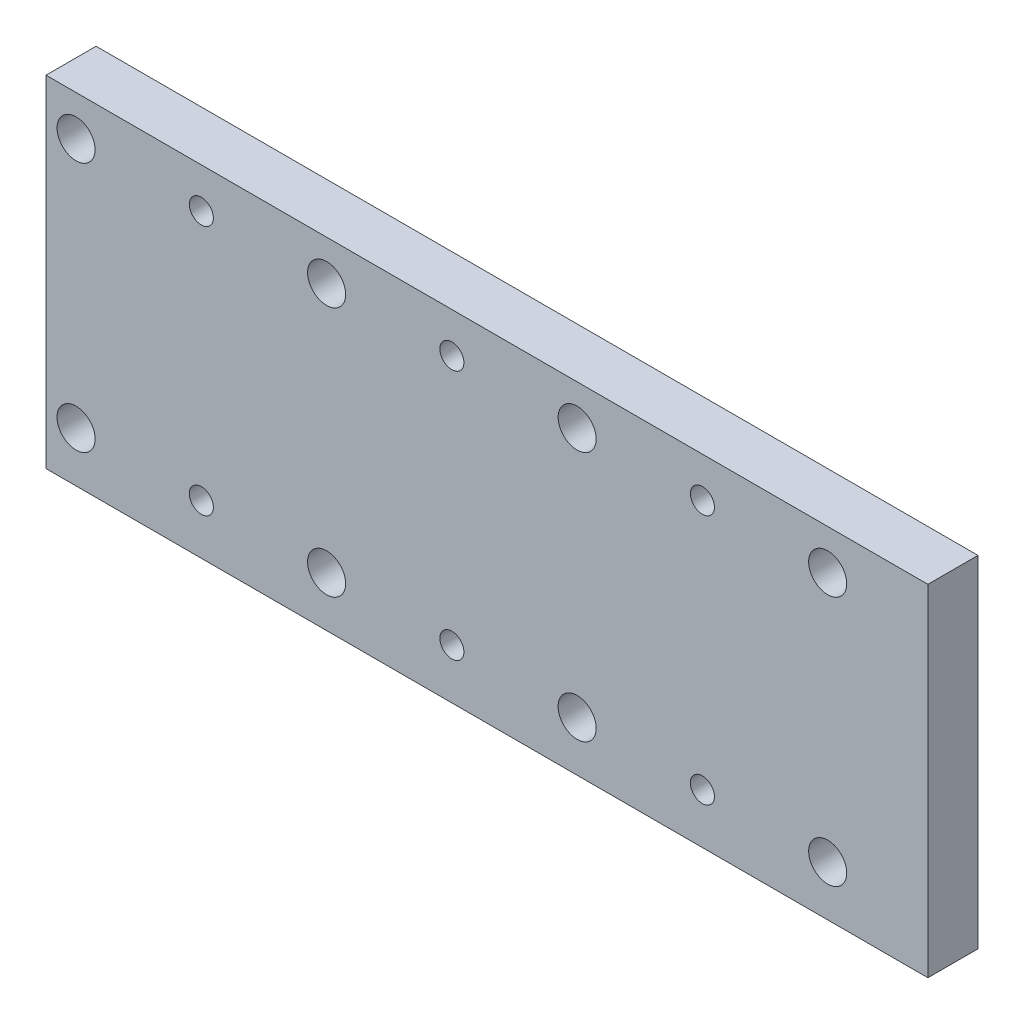
ISO-10303-21;
HEADER;
FILE_DESCRIPTION(('STEP AP214'),'2;1');
FILE_NAME('part.step','',(''),(''),'','','');
FILE_SCHEMA(('AUTOMOTIVE_DESIGN { 1 0 10303 214 1 1 1 1 }'));
ENDSEC;
DATA;
#1=APPLICATION_CONTEXT('core data for automotive mechanical design processes');
#2=APPLICATION_PROTOCOL_DEFINITION('international standard','automotive_design',2000,#1);
#3=PRODUCT_CONTEXT('',#1,'mechanical');
#4=PRODUCT('Part','Part','',(#3));
#5=PRODUCT_RELATED_PRODUCT_CATEGORY('part','',(#4));
#6=PRODUCT_DEFINITION_FORMATION('','',#4);
#7=PRODUCT_DEFINITION_CONTEXT('part definition',#1,'design');
#8=PRODUCT_DEFINITION('design','',#6,#7);
#9=PRODUCT_DEFINITION_SHAPE('','',#8);
#10=(LENGTH_UNIT() NAMED_UNIT(*) SI_UNIT(.MILLI.,.METRE.));
#11=(NAMED_UNIT(*) PLANE_ANGLE_UNIT() SI_UNIT($,.RADIAN.));
#12=(NAMED_UNIT(*) SI_UNIT($,.STERADIAN.) SOLID_ANGLE_UNIT());
#13=UNCERTAINTY_MEASURE_WITH_UNIT(LENGTH_MEASURE(1.E-05),#10,'distance_accuracy_value','');
#14=(GEOMETRIC_REPRESENTATION_CONTEXT(3) GLOBAL_UNCERTAINTY_ASSIGNED_CONTEXT((#13)) GLOBAL_UNIT_ASSIGNED_CONTEXT((#10,
#11,#12)) REPRESENTATION_CONTEXT('',''));
#15=CARTESIAN_POINT('',(0.,0.,0.));
#16=DIRECTION('',(0.,0.,1.));
#17=DIRECTION('',(1.,0.,0.));
#18=AXIS2_PLACEMENT_3D('',#15,#16,#17);
#19=CARTESIAN_POINT('',(220.,85.,25.));
#20=DIRECTION('',(-1.,0.,0.));
#21=DIRECTION('',(0.,0.,1.));
#22=AXIS2_PLACEMENT_3D('',#19,#20,#21);
#23=PLANE('',#22);
#24=DIRECTION('',(0.,1.,0.));
#25=VECTOR('',#24,1.);
#26=CARTESIAN_POINT('',(220.,85.,0.));
#27=LINE('',#26,#25);
#28=CARTESIAN_POINT('',(220.,-85.,0.));
#29=VERTEX_POINT('',#28);
#30=CARTESIAN_POINT('',(220.,85.,0.));
#31=VERTEX_POINT('',#30);
#32=EDGE_CURVE('E107',#29,#31,#27,.T.);
#33=ORIENTED_EDGE('',*,*,#32,.T.);
#34=DIRECTION('',(0.,0.,-1.));
#35=VECTOR('',#34,1.);
#36=CARTESIAN_POINT('',(220.,85.,25.));
#37=LINE('',#36,#35);
#38=CARTESIAN_POINT('',(220.,85.,25.));
#39=VERTEX_POINT('',#38);
#40=EDGE_CURVE('E12',#39,#31,#37,.T.);
#41=ORIENTED_EDGE('',*,*,#40,.F.);
#42=DIRECTION('',(0.,1.,0.));
#43=VECTOR('',#42,1.);
#44=CARTESIAN_POINT('',(220.,85.,25.));
#45=LINE('',#44,#43);
#46=CARTESIAN_POINT('',(220.,-85.,25.));
#47=VERTEX_POINT('',#46);
#48=EDGE_CURVE('E95',#47,#39,#45,.T.);
#49=ORIENTED_EDGE('',*,*,#48,.F.);
#50=DIRECTION('',(0.,0.,-1.));
#51=VECTOR('',#50,1.);
#52=CARTESIAN_POINT('',(220.,-85.,25.));
#53=LINE('',#52,#51);
#54=EDGE_CURVE('E103',#47,#29,#53,.T.);
#55=ORIENTED_EDGE('',*,*,#54,.T.);
#56=EDGE_LOOP('',(#33,#41,#49,#55));
#57=FACE_BOUND('',#56,.T.);
#58=ADVANCED_FACE('F44',(#57),#23,.F.);
#59=CARTESIAN_POINT('',(-220.,85.,25.));
#60=DIRECTION('',(0.,-1.,0.));
#61=DIRECTION('',(0.,0.,-1.));
#62=AXIS2_PLACEMENT_3D('',#59,#60,#61);
#63=PLANE('',#62);
#64=DIRECTION('',(-1.,0.,0.));
#65=VECTOR('',#64,1.);
#66=CARTESIAN_POINT('',(-220.,85.,0.));
#67=LINE('',#66,#65);
#68=CARTESIAN_POINT('',(-220.,85.,0.));
#69=VERTEX_POINT('',#68);
#70=EDGE_CURVE('E99',#31,#69,#67,.T.);
#71=ORIENTED_EDGE('',*,*,#70,.T.);
#72=DIRECTION('',(0.,0.,-1.));
#73=VECTOR('',#72,1.);
#74=CARTESIAN_POINT('',(-220.,85.,25.));
#75=LINE('',#74,#73);
#76=CARTESIAN_POINT('',(-220.,85.,25.));
#77=VERTEX_POINT('',#76);
#78=EDGE_CURVE('E52',#77,#69,#75,.T.);
#79=ORIENTED_EDGE('',*,*,#78,.F.);
#80=DIRECTION('',(-1.,0.,0.));
#81=VECTOR('',#80,1.);
#82=CARTESIAN_POINT('',(-220.,85.,25.));
#83=LINE('',#82,#81);
#84=EDGE_CURVE('E90',#39,#77,#83,.T.);
#85=ORIENTED_EDGE('',*,*,#84,.F.);
#86=ORIENTED_EDGE('',*,*,#40,.T.);
#87=EDGE_LOOP('',(#71,#79,#85,#86));
#88=FACE_BOUND('',#87,.T.);
#89=ADVANCED_FACE('F98',(#88),#63,.F.);
#90=CARTESIAN_POINT('',(-220.,85.,25.));
#91=DIRECTION('',(1.,0.,0.));
#92=DIRECTION('',(0.,0.,-1.));
#93=AXIS2_PLACEMENT_3D('',#90,#91,#92);
#94=PLANE('',#93);
#95=DIRECTION('',(0.,-1.,0.));
#96=VECTOR('',#95,1.);
#97=CARTESIAN_POINT('',(-220.,85.,0.));
#98=LINE('',#97,#96);
#99=CARTESIAN_POINT('',(-220.,-85.,0.));
#100=VERTEX_POINT('',#99);
#101=EDGE_CURVE('E77',#69,#100,#98,.T.);
#102=ORIENTED_EDGE('',*,*,#101,.T.);
#103=DIRECTION('',(0.,0.,-1.));
#104=VECTOR('',#103,1.);
#105=CARTESIAN_POINT('',(-220.,-85.,25.));
#106=LINE('',#105,#104);
#107=CARTESIAN_POINT('',(-220.,-85.,25.));
#108=VERTEX_POINT('',#107);
#109=EDGE_CURVE('E100',#108,#100,#106,.T.);
#110=ORIENTED_EDGE('',*,*,#109,.F.);
#111=DIRECTION('',(0.,-1.,0.));
#112=VECTOR('',#111,1.);
#113=CARTESIAN_POINT('',(-220.,85.,25.));
#114=LINE('',#113,#112);
#115=EDGE_CURVE('E93',#77,#108,#114,.T.);
#116=ORIENTED_EDGE('',*,*,#115,.F.);
#117=ORIENTED_EDGE('',*,*,#78,.T.);
#118=EDGE_LOOP('',(#102,#110,#116,#117));
#119=FACE_BOUND('',#118,.T.);
#120=ADVANCED_FACE('F101',(#119),#94,.F.);
#121=CARTESIAN_POINT('',(-220.,-85.,25.));
#122=DIRECTION('',(0.,1.,0.));
#123=DIRECTION('',(0.,0.,1.));
#124=AXIS2_PLACEMENT_3D('',#121,#122,#123);
#125=PLANE('',#124);
#126=DIRECTION('',(1.,0.,0.));
#127=VECTOR('',#126,1.);
#128=CARTESIAN_POINT('',(-220.,-85.,0.));
#129=LINE('',#128,#127);
#130=EDGE_CURVE('E83',#100,#29,#129,.T.);
#131=ORIENTED_EDGE('',*,*,#130,.T.);
#132=ORIENTED_EDGE('',*,*,#54,.F.);
#133=DIRECTION('',(1.,0.,0.));
#134=VECTOR('',#133,1.);
#135=CARTESIAN_POINT('',(-220.,-85.,25.));
#136=LINE('',#135,#134);
#137=EDGE_CURVE('E60',#108,#47,#136,.T.);
#138=ORIENTED_EDGE('',*,*,#137,.F.);
#139=ORIENTED_EDGE('',*,*,#109,.T.);
#140=EDGE_LOOP('',(#131,#132,#138,#139));
#141=FACE_BOUND('',#140,.T.);
#142=ADVANCED_FACE('F118',(#141),#125,.F.);
#143=CARTESIAN_POINT('',(0.,0.,25.));
#144=DIRECTION('',(0.,0.,1.));
#145=DIRECTION('',(1.,0.,0.));
#146=AXIS2_PLACEMENT_3D('',#143,#144,#145);
#147=PLANE('',#146);
#148=CARTESIAN_POINT('',(107.5,65.,25.));
#149=DIRECTION('',(0.,0.,-1.));
#150=DIRECTION('',(-1.,0.,0.));
#151=AXIS2_PLACEMENT_3D('',#148,#149,#150);
#152=CIRCLE('',#151,6.);
#153=CARTESIAN_POINT('',(101.5,65.,25.));
#154=VERTEX_POINT('',#153);
#155=EDGE_CURVE('E265',#154,#154,#152,.T.);
#156=ORIENTED_EDGE('',*,*,#155,.T.);
#157=EDGE_LOOP('',(#156));
#158=FACE_BOUND('',#157,.T.);
#159=CARTESIAN_POINT('',(-142.5,65.,25.));
#160=DIRECTION('',(0.,0.,-1.));
#161=DIRECTION('',(-1.,0.,0.));
#162=AXIS2_PLACEMENT_3D('',#159,#160,#161);
#163=CIRCLE('',#162,6.00000000000002);
#164=CARTESIAN_POINT('',(-148.5,65.,25.));
#165=VERTEX_POINT('',#164);
#166=EDGE_CURVE('E271',#165,#165,#163,.T.);
#167=ORIENTED_EDGE('',*,*,#166,.T.);
#168=EDGE_LOOP('',(#167));
#169=FACE_BOUND('',#168,.T.);
#170=CARTESIAN_POINT('',(-17.5000000000001,65.,25.));
#171=DIRECTION('',(0.,0.,-1.));
#172=DIRECTION('',(-1.,0.,0.));
#173=AXIS2_PLACEMENT_3D('',#170,#171,#172);
#174=CIRCLE('',#173,6.00000000000001);
#175=CARTESIAN_POINT('',(-23.5000000000001,65.,25.));
#176=VERTEX_POINT('',#175);
#177=EDGE_CURVE('E277',#176,#176,#174,.T.);
#178=ORIENTED_EDGE('',*,*,#177,.T.);
#179=EDGE_LOOP('',(#178));
#180=FACE_BOUND('',#179,.T.);
#181=CARTESIAN_POINT('',(-142.5,-60.,25.));
#182=DIRECTION('',(0.,0.,-1.));
#183=DIRECTION('',(-1.,0.,0.));
#184=AXIS2_PLACEMENT_3D('',#181,#182,#183);
#185=CIRCLE('',#184,6.00000000000002);
#186=CARTESIAN_POINT('',(-148.5,-60.,25.));
#187=VERTEX_POINT('',#186);
#188=EDGE_CURVE('E283',#187,#187,#185,.T.);
#189=ORIENTED_EDGE('',*,*,#188,.T.);
#190=EDGE_LOOP('',(#189));
#191=FACE_BOUND('',#190,.T.);
#192=CARTESIAN_POINT('',(-17.5000000000001,-60.,25.));
#193=DIRECTION('',(0.,0.,-1.));
#194=DIRECTION('',(-1.,0.,0.));
#195=AXIS2_PLACEMENT_3D('',#192,#193,#194);
#196=CIRCLE('',#195,6.00000000000001);
#197=CARTESIAN_POINT('',(-23.5000000000001,-60.,25.));
#198=VERTEX_POINT('',#197);
#199=EDGE_CURVE('E259',#198,#198,#196,.T.);
#200=ORIENTED_EDGE('',*,*,#199,.T.);
#201=EDGE_LOOP('',(#200));
#202=FACE_BOUND('',#201,.T.);
#203=CARTESIAN_POINT('',(107.5,-60.,25.));
#204=DIRECTION('',(0.,0.,-1.));
#205=DIRECTION('',(-1.,0.,0.));
#206=AXIS2_PLACEMENT_3D('',#203,#204,#205);
#207=CIRCLE('',#206,6.);
#208=CARTESIAN_POINT('',(101.5,-60.,25.));
#209=VERTEX_POINT('',#208);
#210=EDGE_CURVE('E230',#209,#209,#207,.T.);
#211=ORIENTED_EDGE('',*,*,#210,.T.);
#212=EDGE_LOOP('',(#211));
#213=FACE_BOUND('',#212,.T.);
#214=CARTESIAN_POINT('',(-80.0000000000001,65.,25.));
#215=DIRECTION('',(0.,0.,1.));
#216=DIRECTION('',(1.,0.,0.));
#217=AXIS2_PLACEMENT_3D('',#214,#215,#216);
#218=CIRCLE('',#217,9.50000000000001);
#219=CARTESIAN_POINT('',(-70.5000000000001,65.,25.));
#220=VERTEX_POINT('',#219);
#221=EDGE_CURVE('E149',#220,#220,#218,.T.);
#222=ORIENTED_EDGE('',*,*,#221,.F.);
#223=EDGE_LOOP('',(#222));
#224=FACE_BOUND('',#223,.T.);
#225=CARTESIAN_POINT('',(-205.,65.,25.));
#226=DIRECTION('',(0.,0.,1.));
#227=DIRECTION('',(1.,0.,0.));
#228=AXIS2_PLACEMENT_3D('',#225,#226,#227);
#229=CIRCLE('',#228,9.50000000000001);
#230=CARTESIAN_POINT('',(-195.5,65.,25.));
#231=VERTEX_POINT('',#230);
#232=EDGE_CURVE('E143',#231,#231,#229,.T.);
#233=ORIENTED_EDGE('',*,*,#232,.F.);
#234=EDGE_LOOP('',(#233));
#235=FACE_BOUND('',#234,.T.);
#236=CARTESIAN_POINT('',(45.,-60.,25.));
#237=DIRECTION('',(0.,0.,1.));
#238=DIRECTION('',(1.,0.,0.));
#239=AXIS2_PLACEMENT_3D('',#236,#237,#238);
#240=CIRCLE('',#239,9.50000000000001);
#241=CARTESIAN_POINT('',(54.5,-60.,25.));
#242=VERTEX_POINT('',#241);
#243=EDGE_CURVE('E137',#242,#242,#240,.T.);
#244=ORIENTED_EDGE('',*,*,#243,.F.);
#245=EDGE_LOOP('',(#244));
#246=FACE_BOUND('',#245,.T.);
#247=CARTESIAN_POINT('',(-80.,-60.,25.));
#248=DIRECTION('',(0.,0.,1.));
#249=DIRECTION('',(1.,0.,0.));
#250=AXIS2_PLACEMENT_3D('',#247,#248,#249);
#251=CIRCLE('',#250,9.50000000000001);
#252=CARTESIAN_POINT('',(-70.5,-60.,25.));
#253=VERTEX_POINT('',#252);
#254=EDGE_CURVE('E130',#253,#253,#251,.T.);
#255=ORIENTED_EDGE('',*,*,#254,.F.);
#256=EDGE_LOOP('',(#255));
#257=FACE_BOUND('',#256,.T.);
#258=CARTESIAN_POINT('',(-205.,-60.,25.));
#259=DIRECTION('',(0.,0.,1.));
#260=DIRECTION('',(1.,0.,0.));
#261=AXIS2_PLACEMENT_3D('',#258,#259,#260);
#262=CIRCLE('',#261,9.50000000000001);
#263=CARTESIAN_POINT('',(-195.5,-60.,25.));
#264=VERTEX_POINT('',#263);
#265=EDGE_CURVE('E167',#264,#264,#262,.T.);
#266=ORIENTED_EDGE('',*,*,#265,.F.);
#267=EDGE_LOOP('',(#266));
#268=FACE_BOUND('',#267,.T.);
#269=CARTESIAN_POINT('',(170.,-60.,25.));
#270=DIRECTION('',(0.,0.,1.));
#271=DIRECTION('',(1.,0.,0.));
#272=AXIS2_PLACEMENT_3D('',#269,#270,#271);
#273=CIRCLE('',#272,9.50000000000001);
#274=CARTESIAN_POINT('',(179.5,-60.,25.));
#275=VERTEX_POINT('',#274);
#276=EDGE_CURVE('E161',#275,#275,#273,.T.);
#277=ORIENTED_EDGE('',*,*,#276,.F.);
#278=EDGE_LOOP('',(#277));
#279=FACE_BOUND('',#278,.T.);
#280=CARTESIAN_POINT('',(170.,65.,25.));
#281=DIRECTION('',(0.,0.,1.));
#282=DIRECTION('',(1.,0.,0.));
#283=AXIS2_PLACEMENT_3D('',#280,#281,#282);
#284=CIRCLE('',#283,9.50000000000001);
#285=CARTESIAN_POINT('',(179.5,65.,25.));
#286=VERTEX_POINT('',#285);
#287=EDGE_CURVE('E154',#286,#286,#284,.T.);
#288=ORIENTED_EDGE('',*,*,#287,.F.);
#289=EDGE_LOOP('',(#288));
#290=FACE_BOUND('',#289,.T.);
#291=CARTESIAN_POINT('',(44.9999999999999,65.,25.));
#292=DIRECTION('',(0.,0.,1.));
#293=DIRECTION('',(1.,0.,0.));
#294=AXIS2_PLACEMENT_3D('',#291,#292,#293);
#295=CIRCLE('',#294,9.50000000000001);
#296=CARTESIAN_POINT('',(54.4999999999999,65.,25.));
#297=VERTEX_POINT('',#296);
#298=EDGE_CURVE('E124',#297,#297,#295,.T.);
#299=ORIENTED_EDGE('',*,*,#298,.F.);
#300=EDGE_LOOP('',(#299));
#301=FACE_BOUND('',#300,.T.);
#302=ORIENTED_EDGE('',*,*,#48,.T.);
#303=ORIENTED_EDGE('',*,*,#84,.T.);
#304=ORIENTED_EDGE('',*,*,#115,.T.);
#305=ORIENTED_EDGE('',*,*,#137,.T.);
#306=EDGE_LOOP('',(#302,#303,#304,#305));
#307=FACE_BOUND('',#306,.T.);
#308=ADVANCED_FACE('F91',(#158,#169,#180,#191,#202,#213,#224,#235,#246,#257,#268,#279,#290,#301,
#307),#147,.T.);
#309=CARTESIAN_POINT('',(0.,0.,0.));
#310=DIRECTION('',(0.,0.,1.));
#311=DIRECTION('',(1.,0.,0.));
#312=AXIS2_PLACEMENT_3D('',#309,#310,#311);
#313=PLANE('',#312);
#314=CARTESIAN_POINT('',(107.5,65.,0.));
#315=DIRECTION('',(0.,0.,-1.));
#316=DIRECTION('',(-1.,0.,0.));
#317=AXIS2_PLACEMENT_3D('',#314,#315,#316);
#318=CIRCLE('',#317,9.49999999999998);
#319=CARTESIAN_POINT('',(98.0000000000004,65.,0.));
#320=VERTEX_POINT('',#319);
#321=EDGE_CURVE('E226',#320,#320,#318,.T.);
#322=ORIENTED_EDGE('',*,*,#321,.F.);
#323=EDGE_LOOP('',(#322));
#324=FACE_BOUND('',#323,.T.);
#325=CARTESIAN_POINT('',(-142.5,65.,0.));
#326=DIRECTION('',(0.,0.,-1.));
#327=DIRECTION('',(-1.,0.,0.));
#328=AXIS2_PLACEMENT_3D('',#325,#326,#327);
#329=CIRCLE('',#328,9.50000000000001);
#330=CARTESIAN_POINT('',(-152.,65.,0.));
#331=VERTEX_POINT('',#330);
#332=EDGE_CURVE('E233',#331,#331,#329,.T.);
#333=ORIENTED_EDGE('',*,*,#332,.F.);
#334=EDGE_LOOP('',(#333));
#335=FACE_BOUND('',#334,.T.);
#336=CARTESIAN_POINT('',(-17.4999999999996,65.,0.));
#337=DIRECTION('',(0.,0.,-1.));
#338=DIRECTION('',(-1.,0.,0.));
#339=AXIS2_PLACEMENT_3D('',#336,#337,#338);
#340=CIRCLE('',#339,9.49999999999999);
#341=CARTESIAN_POINT('',(-26.9999999999996,65.,0.));
#342=VERTEX_POINT('',#341);
#343=EDGE_CURVE('E239',#342,#342,#340,.T.);
#344=ORIENTED_EDGE('',*,*,#343,.F.);
#345=EDGE_LOOP('',(#344));
#346=FACE_BOUND('',#345,.T.);
#347=CARTESIAN_POINT('',(-142.5,-60.,0.));
#348=DIRECTION('',(0.,0.,-1.));
#349=DIRECTION('',(-1.,0.,0.));
#350=AXIS2_PLACEMENT_3D('',#347,#348,#349);
#351=CIRCLE('',#350,9.49999999999998);
#352=CARTESIAN_POINT('',(-152.,-60.,0.));
#353=VERTEX_POINT('',#352);
#354=EDGE_CURVE('E245',#353,#353,#351,.T.);
#355=ORIENTED_EDGE('',*,*,#354,.F.);
#356=EDGE_LOOP('',(#355));
#357=FACE_BOUND('',#356,.T.);
#358=CARTESIAN_POINT('',(-17.5000000000001,-60.,0.));
#359=DIRECTION('',(0.,0.,-1.));
#360=DIRECTION('',(-1.,0.,0.));
#361=AXIS2_PLACEMENT_3D('',#358,#359,#360);
#362=CIRCLE('',#361,9.5);
#363=CARTESIAN_POINT('',(-27.0000000000001,-60.,0.));
#364=VERTEX_POINT('',#363);
#365=EDGE_CURVE('E251',#364,#364,#362,.T.);
#366=ORIENTED_EDGE('',*,*,#365,.F.);
#367=EDGE_LOOP('',(#366));
#368=FACE_BOUND('',#367,.T.);
#369=CARTESIAN_POINT('',(107.5,-60.,0.));
#370=DIRECTION('',(0.,0.,-1.));
#371=DIRECTION('',(-1.,0.,0.));
#372=AXIS2_PLACEMENT_3D('',#369,#370,#371);
#373=CIRCLE('',#372,9.5);
#374=CARTESIAN_POINT('',(97.9999999999999,-60.,0.));
#375=VERTEX_POINT('',#374);
#376=EDGE_CURVE('E220',#375,#375,#373,.T.);
#377=ORIENTED_EDGE('',*,*,#376,.F.);
#378=EDGE_LOOP('',(#377));
#379=FACE_BOUND('',#378,.T.);
#380=CARTESIAN_POINT('',(44.9999999999999,-60.0000000000008,0.));
#381=DIRECTION('',(0.,0.,1.));
#382=DIRECTION('',(1.,0.,0.));
#383=AXIS2_PLACEMENT_3D('',#380,#381,#382);
#384=CIRCLE('',#383,6.00000000000002);
#385=CARTESIAN_POINT('',(51.,-60.0000000000008,0.));
#386=VERTEX_POINT('',#385);
#387=EDGE_CURVE('E193',#386,#386,#384,.T.);
#388=ORIENTED_EDGE('',*,*,#387,.T.);
#389=EDGE_LOOP('',(#388));
#390=FACE_BOUND('',#389,.T.);
#391=CARTESIAN_POINT('',(-205.,64.9999999999974,0.));
#392=DIRECTION('',(0.,0.,1.));
#393=DIRECTION('',(1.,0.,0.));
#394=AXIS2_PLACEMENT_3D('',#391,#392,#393);
#395=CIRCLE('',#394,6.00000000000002);
#396=CARTESIAN_POINT('',(-199.,64.9999999999974,0.));
#397=VERTEX_POINT('',#396);
#398=EDGE_CURVE('E182',#397,#397,#395,.T.);
#399=ORIENTED_EDGE('',*,*,#398,.T.);
#400=EDGE_LOOP('',(#399));
#401=FACE_BOUND('',#400,.T.);
#402=CARTESIAN_POINT('',(-80.0000000000001,64.9999999999983,0.));
#403=DIRECTION('',(0.,0.,1.));
#404=DIRECTION('',(1.,0.,0.));
#405=AXIS2_PLACEMENT_3D('',#402,#403,#404);
#406=CIRCLE('',#405,6.00000000000002);
#407=CARTESIAN_POINT('',(-74.0000000000001,64.9999999999983,0.));
#408=VERTEX_POINT('',#407);
#409=EDGE_CURVE('E181',#408,#408,#406,.T.);
#410=ORIENTED_EDGE('',*,*,#409,.T.);
#411=EDGE_LOOP('',(#410));
#412=FACE_BOUND('',#411,.T.);
#413=CARTESIAN_POINT('',(44.9999999999999,64.9999999999991,0.));
#414=DIRECTION('',(0.,0.,1.));
#415=DIRECTION('',(1.,0.,0.));
#416=AXIS2_PLACEMENT_3D('',#413,#414,#415);
#417=CIRCLE('',#416,6.00000000000002);
#418=CARTESIAN_POINT('',(51.,64.9999999999991,0.));
#419=VERTEX_POINT('',#418);
#420=EDGE_CURVE('E175',#419,#419,#417,.T.);
#421=ORIENTED_EDGE('',*,*,#420,.T.);
#422=EDGE_LOOP('',(#421));
#423=FACE_BOUND('',#422,.T.);
#424=CARTESIAN_POINT('',(-80.0000000000001,-60.0000000000017,0.));
#425=DIRECTION('',(0.,0.,1.));
#426=DIRECTION('',(1.,0.,0.));
#427=AXIS2_PLACEMENT_3D('',#424,#425,#426);
#428=CIRCLE('',#427,6.00000000000002);
#429=CARTESIAN_POINT('',(-74.0000000000001,-60.0000000000017,0.));
#430=VERTEX_POINT('',#429);
#431=EDGE_CURVE('E194',#430,#430,#428,.T.);
#432=ORIENTED_EDGE('',*,*,#431,.T.);
#433=EDGE_LOOP('',(#432));
#434=FACE_BOUND('',#433,.T.);
#435=CARTESIAN_POINT('',(-205.,-60.0000000000026,0.));
#436=DIRECTION('',(0.,0.,1.));
#437=DIRECTION('',(1.,0.,0.));
#438=AXIS2_PLACEMENT_3D('',#435,#436,#437);
#439=CIRCLE('',#438,6.00000000000002);
#440=CARTESIAN_POINT('',(-199.,-60.0000000000026,0.));
#441=VERTEX_POINT('',#440);
#442=EDGE_CURVE('E212',#441,#441,#439,.T.);
#443=ORIENTED_EDGE('',*,*,#442,.T.);
#444=EDGE_LOOP('',(#443));
#445=FACE_BOUND('',#444,.T.);
#446=CARTESIAN_POINT('',(170.,-60.,0.));
#447=DIRECTION('',(0.,0.,1.));
#448=DIRECTION('',(1.,0.,0.));
#449=AXIS2_PLACEMENT_3D('',#446,#447,#448);
#450=CIRCLE('',#449,6.00000000000002);
#451=CARTESIAN_POINT('',(176.,-60.,0.));
#452=VERTEX_POINT('',#451);
#453=EDGE_CURVE('E205',#452,#452,#450,.T.);
#454=ORIENTED_EDGE('',*,*,#453,.T.);
#455=EDGE_LOOP('',(#454));
#456=FACE_BOUND('',#455,.T.);
#457=CARTESIAN_POINT('',(170.,65.,0.));
#458=DIRECTION('',(0.,0.,1.));
#459=DIRECTION('',(1.,0.,0.));
#460=AXIS2_PLACEMENT_3D('',#457,#458,#459);
#461=CIRCLE('',#460,6.00000000000002);
#462=CARTESIAN_POINT('',(176.,65.,0.));
#463=VERTEX_POINT('',#462);
#464=EDGE_CURVE('E158',#463,#463,#461,.T.);
#465=ORIENTED_EDGE('',*,*,#464,.T.);
#466=EDGE_LOOP('',(#465));
#467=FACE_BOUND('',#466,.T.);
#468=ORIENTED_EDGE('',*,*,#32,.F.);
#469=ORIENTED_EDGE('',*,*,#130,.F.);
#470=ORIENTED_EDGE('',*,*,#101,.F.);
#471=ORIENTED_EDGE('',*,*,#70,.F.);
#472=EDGE_LOOP('',(#468,#469,#470,#471));
#473=FACE_BOUND('',#472,.T.);
#474=ADVANCED_FACE('F121',(#324,#335,#346,#357,#368,#379,#390,#401,#412,#423,#434,#445,#456,
#467,#473),#313,.F.);
#475=CARTESIAN_POINT('',(44.9999999999999,65.,10.));
#476=DIRECTION('',(0.,0.,1.));
#477=DIRECTION('',(1.,0.,0.));
#478=AXIS2_PLACEMENT_3D('',#475,#476,#477);
#479=CYLINDRICAL_SURFACE('',#478,9.50000000000001);
#480=CARTESIAN_POINT('',(44.9999999999999,65.,10.));
#481=DIRECTION('',(0.,0.,1.));
#482=DIRECTION('',(1.,0.,0.));
#483=AXIS2_PLACEMENT_3D('',#480,#481,#482);
#484=CIRCLE('',#483,9.50000000000001);
#485=CARTESIAN_POINT('',(54.4999999999999,65.,10.));
#486=VERTEX_POINT('',#485);
#487=EDGE_CURVE('E110',#486,#486,#484,.T.);
#488=ORIENTED_EDGE('',*,*,#487,.F.);
#489=EDGE_LOOP('',(#488));
#490=FACE_BOUND('',#489,.T.);
#491=ORIENTED_EDGE('',*,*,#298,.T.);
#492=EDGE_LOOP('',(#491));
#493=FACE_BOUND('',#492,.T.);
#494=ADVANCED_FACE('F318',(#490,#493),#479,.F.);
#495=CARTESIAN_POINT('',(44.9999999999999,65.,10.));
#496=DIRECTION('',(0.,0.,1.));
#497=DIRECTION('',(1.,0.,0.));
#498=AXIS2_PLACEMENT_3D('',#495,#496,#497);
#499=PLANE('',#498);
#500=CARTESIAN_POINT('',(44.9999999999999,64.9999999999991,10.));
#501=DIRECTION('',(0.,0.,1.));
#502=DIRECTION('',(1.,0.,0.));
#503=AXIS2_PLACEMENT_3D('',#500,#501,#502);
#504=CIRCLE('',#503,6.00000000000002);
#505=CARTESIAN_POINT('',(51.,64.9999999999991,10.));
#506=VERTEX_POINT('',#505);
#507=EDGE_CURVE('E185',#506,#506,#504,.T.);
#508=ORIENTED_EDGE('',*,*,#507,.F.);
#509=EDGE_LOOP('',(#508));
#510=FACE_BOUND('',#509,.T.);
#511=ORIENTED_EDGE('',*,*,#487,.T.);
#512=EDGE_LOOP('',(#511));
#513=FACE_BOUND('',#512,.T.);
#514=ADVANCED_FACE('F357',(#510,#513),#499,.T.);
#515=CARTESIAN_POINT('',(170.,65.,10.));
#516=DIRECTION('',(0.,0.,1.));
#517=DIRECTION('',(1.,0.,0.));
#518=AXIS2_PLACEMENT_3D('',#515,#516,#517);
#519=CYLINDRICAL_SURFACE('',#518,9.50000000000001);
#520=CARTESIAN_POINT('',(170.,65.,10.));
#521=DIRECTION('',(0.,0.,1.));
#522=DIRECTION('',(1.,0.,0.));
#523=AXIS2_PLACEMENT_3D('',#520,#521,#522);
#524=CIRCLE('',#523,9.50000000000001);
#525=CARTESIAN_POINT('',(179.5,65.,10.));
#526=VERTEX_POINT('',#525);
#527=EDGE_CURVE('E157',#526,#526,#524,.T.);
#528=ORIENTED_EDGE('',*,*,#527,.F.);
#529=EDGE_LOOP('',(#528));
#530=FACE_BOUND('',#529,.T.);
#531=ORIENTED_EDGE('',*,*,#287,.T.);
#532=EDGE_LOOP('',(#531));
#533=FACE_BOUND('',#532,.T.);
#534=ADVANCED_FACE('F351',(#530,#533),#519,.F.);
#535=CARTESIAN_POINT('',(170.,65.,10.));
#536=DIRECTION('',(0.,0.,1.));
#537=DIRECTION('',(1.,0.,0.));
#538=AXIS2_PLACEMENT_3D('',#535,#536,#537);
#539=PLANE('',#538);
#540=CARTESIAN_POINT('',(170.,65.,10.));
#541=DIRECTION('',(0.,0.,1.));
#542=DIRECTION('',(1.,0.,0.));
#543=AXIS2_PLACEMENT_3D('',#540,#541,#542);
#544=CIRCLE('',#543,6.00000000000002);
#545=CARTESIAN_POINT('',(176.,65.,10.));
#546=VERTEX_POINT('',#545);
#547=EDGE_CURVE('E172',#546,#546,#544,.T.);
#548=ORIENTED_EDGE('',*,*,#547,.F.);
#549=EDGE_LOOP('',(#548));
#550=FACE_BOUND('',#549,.T.);
#551=ORIENTED_EDGE('',*,*,#527,.T.);
#552=EDGE_LOOP('',(#551));
#553=FACE_BOUND('',#552,.T.);
#554=ADVANCED_FACE('F347',(#550,#553),#539,.T.);
#555=CARTESIAN_POINT('',(170.,-60.,10.));
#556=DIRECTION('',(0.,0.,1.));
#557=DIRECTION('',(1.,0.,0.));
#558=AXIS2_PLACEMENT_3D('',#555,#556,#557);
#559=CYLINDRICAL_SURFACE('',#558,9.50000000000001);
#560=CARTESIAN_POINT('',(170.,-60.,10.));
#561=DIRECTION('',(0.,0.,1.));
#562=DIRECTION('',(1.,0.,0.));
#563=AXIS2_PLACEMENT_3D('',#560,#561,#562);
#564=CIRCLE('',#563,9.50000000000001);
#565=CARTESIAN_POINT('',(179.5,-60.,10.));
#566=VERTEX_POINT('',#565);
#567=EDGE_CURVE('E164',#566,#566,#564,.T.);
#568=ORIENTED_EDGE('',*,*,#567,.F.);
#569=EDGE_LOOP('',(#568));
#570=FACE_BOUND('',#569,.T.);
#571=ORIENTED_EDGE('',*,*,#276,.T.);
#572=EDGE_LOOP('',(#571));
#573=FACE_BOUND('',#572,.T.);
#574=ADVANCED_FACE('F350',(#570,#573),#559,.F.);
#575=CARTESIAN_POINT('',(170.,-60.,10.));
#576=DIRECTION('',(0.,0.,1.));
#577=DIRECTION('',(1.,0.,0.));
#578=AXIS2_PLACEMENT_3D('',#575,#576,#577);
#579=PLANE('',#578);
#580=CARTESIAN_POINT('',(170.,-60.,10.));
#581=DIRECTION('',(0.,0.,1.));
#582=DIRECTION('',(1.,0.,0.));
#583=AXIS2_PLACEMENT_3D('',#580,#581,#582);
#584=CIRCLE('',#583,6.00000000000002);
#585=CARTESIAN_POINT('',(176.,-60.,10.));
#586=VERTEX_POINT('',#585);
#587=EDGE_CURVE('E202',#586,#586,#584,.T.);
#588=ORIENTED_EDGE('',*,*,#587,.F.);
#589=EDGE_LOOP('',(#588));
#590=FACE_BOUND('',#589,.T.);
#591=ORIENTED_EDGE('',*,*,#567,.T.);
#592=EDGE_LOOP('',(#591));
#593=FACE_BOUND('',#592,.T.);
#594=ADVANCED_FACE('F454',(#590,#593),#579,.T.);
#595=CARTESIAN_POINT('',(-205.,-60.,10.));
#596=DIRECTION('',(0.,0.,1.));
#597=DIRECTION('',(1.,0.,0.));
#598=AXIS2_PLACEMENT_3D('',#595,#596,#597);
#599=CYLINDRICAL_SURFACE('',#598,9.50000000000001);
#600=CARTESIAN_POINT('',(-205.,-60.,10.));
#601=DIRECTION('',(0.,0.,1.));
#602=DIRECTION('',(1.,0.,0.));
#603=AXIS2_PLACEMENT_3D('',#600,#601,#602);
#604=CIRCLE('',#603,9.50000000000001);
#605=CARTESIAN_POINT('',(-195.5,-60.,10.));
#606=VERTEX_POINT('',#605);
#607=EDGE_CURVE('E134',#606,#606,#604,.T.);
#608=ORIENTED_EDGE('',*,*,#607,.F.);
#609=EDGE_LOOP('',(#608));
#610=FACE_BOUND('',#609,.T.);
#611=ORIENTED_EDGE('',*,*,#265,.T.);
#612=EDGE_LOOP('',(#611));
#613=FACE_BOUND('',#612,.T.);
#614=ADVANCED_FACE('F463',(#610,#613),#599,.F.);
#615=CARTESIAN_POINT('',(-205.,-60.,10.));
#616=DIRECTION('',(0.,0.,1.));
#617=DIRECTION('',(1.,0.,0.));
#618=AXIS2_PLACEMENT_3D('',#615,#616,#617);
#619=PLANE('',#618);
#620=CARTESIAN_POINT('',(-205.,-60.0000000000026,10.));
#621=DIRECTION('',(0.,0.,1.));
#622=DIRECTION('',(1.,0.,0.));
#623=AXIS2_PLACEMENT_3D('',#620,#621,#622);
#624=CIRCLE('',#623,6.00000000000002);
#625=CARTESIAN_POINT('',(-199.,-60.0000000000026,10.));
#626=VERTEX_POINT('',#625);
#627=EDGE_CURVE('E209',#626,#626,#624,.T.);
#628=ORIENTED_EDGE('',*,*,#627,.F.);
#629=EDGE_LOOP('',(#628));
#630=FACE_BOUND('',#629,.T.);
#631=ORIENTED_EDGE('',*,*,#607,.T.);
#632=EDGE_LOOP('',(#631));
#633=FACE_BOUND('',#632,.T.);
#634=ADVANCED_FACE('F469',(#630,#633),#619,.T.);
#635=CARTESIAN_POINT('',(-80.,-60.,10.));
#636=DIRECTION('',(0.,0.,1.));
#637=DIRECTION('',(1.,0.,0.));
#638=AXIS2_PLACEMENT_3D('',#635,#636,#637);
#639=CYLINDRICAL_SURFACE('',#638,9.50000000000001);
#640=CARTESIAN_POINT('',(-80.,-60.,10.));
#641=DIRECTION('',(0.,0.,1.));
#642=DIRECTION('',(1.,0.,0.));
#643=AXIS2_PLACEMENT_3D('',#640,#641,#642);
#644=CIRCLE('',#643,9.50000000000001);
#645=CARTESIAN_POINT('',(-70.5,-60.,10.));
#646=VERTEX_POINT('',#645);
#647=EDGE_CURVE('E133',#646,#646,#644,.T.);
#648=ORIENTED_EDGE('',*,*,#647,.F.);
#649=EDGE_LOOP('',(#648));
#650=FACE_BOUND('',#649,.T.);
#651=ORIENTED_EDGE('',*,*,#254,.T.);
#652=EDGE_LOOP('',(#651));
#653=FACE_BOUND('',#652,.T.);
#654=ADVANCED_FACE('F478',(#650,#653),#639,.F.);
#655=CARTESIAN_POINT('',(-80.,-60.,10.));
#656=DIRECTION('',(0.,0.,1.));
#657=DIRECTION('',(1.,0.,0.));
#658=AXIS2_PLACEMENT_3D('',#655,#656,#657);
#659=PLANE('',#658);
#660=CARTESIAN_POINT('',(-80.0000000000001,-60.0000000000017,10.));
#661=DIRECTION('',(0.,0.,1.));
#662=DIRECTION('',(1.,0.,0.));
#663=AXIS2_PLACEMENT_3D('',#660,#661,#662);
#664=CIRCLE('',#663,6.00000000000002);
#665=CARTESIAN_POINT('',(-74.0000000000001,-60.0000000000017,10.));
#666=VERTEX_POINT('',#665);
#667=EDGE_CURVE('E215',#666,#666,#664,.T.);
#668=ORIENTED_EDGE('',*,*,#667,.F.);
#669=EDGE_LOOP('',(#668));
#670=FACE_BOUND('',#669,.T.);
#671=ORIENTED_EDGE('',*,*,#647,.T.);
#672=EDGE_LOOP('',(#671));
#673=FACE_BOUND('',#672,.T.);
#674=ADVANCED_FACE('F484',(#670,#673),#659,.T.);
#675=CARTESIAN_POINT('',(45.,-60.,10.));
#676=DIRECTION('',(0.,0.,1.));
#677=DIRECTION('',(1.,0.,0.));
#678=AXIS2_PLACEMENT_3D('',#675,#676,#677);
#679=CYLINDRICAL_SURFACE('',#678,9.50000000000001);
#680=CARTESIAN_POINT('',(45.,-60.,10.));
#681=DIRECTION('',(0.,0.,1.));
#682=DIRECTION('',(1.,0.,0.));
#683=AXIS2_PLACEMENT_3D('',#680,#681,#682);
#684=CIRCLE('',#683,9.50000000000001);
#685=CARTESIAN_POINT('',(54.5,-60.,10.));
#686=VERTEX_POINT('',#685);
#687=EDGE_CURVE('E140',#686,#686,#684,.T.);
#688=ORIENTED_EDGE('',*,*,#687,.F.);
#689=EDGE_LOOP('',(#688));
#690=FACE_BOUND('',#689,.T.);
#691=ORIENTED_EDGE('',*,*,#243,.T.);
#692=EDGE_LOOP('',(#691));
#693=FACE_BOUND('',#692,.T.);
#694=ADVANCED_FACE('F493',(#690,#693),#679,.F.);
#695=CARTESIAN_POINT('',(45.,-60.,10.));
#696=DIRECTION('',(0.,0.,1.));
#697=DIRECTION('',(1.,0.,0.));
#698=AXIS2_PLACEMENT_3D('',#695,#696,#697);
#699=PLANE('',#698);
#700=CARTESIAN_POINT('',(44.9999999999999,-60.0000000000008,10.));
#701=DIRECTION('',(0.,0.,1.));
#702=DIRECTION('',(1.,0.,0.));
#703=AXIS2_PLACEMENT_3D('',#700,#701,#702);
#704=CIRCLE('',#703,6.00000000000002);
#705=CARTESIAN_POINT('',(51.,-60.0000000000008,10.));
#706=VERTEX_POINT('',#705);
#707=EDGE_CURVE('E190',#706,#706,#704,.T.);
#708=ORIENTED_EDGE('',*,*,#707,.F.);
#709=EDGE_LOOP('',(#708));
#710=FACE_BOUND('',#709,.T.);
#711=ORIENTED_EDGE('',*,*,#687,.T.);
#712=EDGE_LOOP('',(#711));
#713=FACE_BOUND('',#712,.T.);
#714=ADVANCED_FACE('F499',(#710,#713),#699,.T.);
#715=CARTESIAN_POINT('',(-205.,65.,10.));
#716=DIRECTION('',(0.,0.,1.));
#717=DIRECTION('',(1.,0.,0.));
#718=AXIS2_PLACEMENT_3D('',#715,#716,#717);
#719=CYLINDRICAL_SURFACE('',#718,9.50000000000001);
#720=CARTESIAN_POINT('',(-205.,65.,10.));
#721=DIRECTION('',(0.,0.,1.));
#722=DIRECTION('',(1.,0.,0.));
#723=AXIS2_PLACEMENT_3D('',#720,#721,#722);
#724=CIRCLE('',#723,9.50000000000001);
#725=CARTESIAN_POINT('',(-195.5,65.,10.));
#726=VERTEX_POINT('',#725);
#727=EDGE_CURVE('E146',#726,#726,#724,.T.);
#728=ORIENTED_EDGE('',*,*,#727,.F.);
#729=EDGE_LOOP('',(#728));
#730=FACE_BOUND('',#729,.T.);
#731=ORIENTED_EDGE('',*,*,#232,.T.);
#732=EDGE_LOOP('',(#731));
#733=FACE_BOUND('',#732,.T.);
#734=ADVANCED_FACE('F508',(#730,#733),#719,.F.);
#735=CARTESIAN_POINT('',(-205.,65.,10.));
#736=DIRECTION('',(0.,0.,1.));
#737=DIRECTION('',(1.,0.,0.));
#738=AXIS2_PLACEMENT_3D('',#735,#736,#737);
#739=PLANE('',#738);
#740=CARTESIAN_POINT('',(-205.,64.9999999999974,10.));
#741=DIRECTION('',(0.,0.,1.));
#742=DIRECTION('',(1.,0.,0.));
#743=AXIS2_PLACEMENT_3D('',#740,#741,#742);
#744=CIRCLE('',#743,6.00000000000002);
#745=CARTESIAN_POINT('',(-199.,64.9999999999974,10.));
#746=VERTEX_POINT('',#745);
#747=EDGE_CURVE('E197',#746,#746,#744,.T.);
#748=ORIENTED_EDGE('',*,*,#747,.F.);
#749=EDGE_LOOP('',(#748));
#750=FACE_BOUND('',#749,.T.);
#751=ORIENTED_EDGE('',*,*,#727,.T.);
#752=EDGE_LOOP('',(#751));
#753=FACE_BOUND('',#752,.T.);
#754=ADVANCED_FACE('F514',(#750,#753),#739,.T.);
#755=CARTESIAN_POINT('',(-80.0000000000001,65.,10.));
#756=DIRECTION('',(0.,0.,1.));
#757=DIRECTION('',(1.,0.,0.));
#758=AXIS2_PLACEMENT_3D('',#755,#756,#757);
#759=CYLINDRICAL_SURFACE('',#758,9.50000000000001);
#760=CARTESIAN_POINT('',(-80.0000000000001,65.,10.));
#761=DIRECTION('',(0.,0.,1.));
#762=DIRECTION('',(1.,0.,0.));
#763=AXIS2_PLACEMENT_3D('',#760,#761,#762);
#764=CIRCLE('',#763,9.50000000000001);
#765=CARTESIAN_POINT('',(-70.5000000000001,65.,10.));
#766=VERTEX_POINT('',#765);
#767=EDGE_CURVE('E127',#766,#766,#764,.T.);
#768=ORIENTED_EDGE('',*,*,#767,.F.);
#769=EDGE_LOOP('',(#768));
#770=FACE_BOUND('',#769,.T.);
#771=ORIENTED_EDGE('',*,*,#221,.T.);
#772=EDGE_LOOP('',(#771));
#773=FACE_BOUND('',#772,.T.);
#774=ADVANCED_FACE('F523',(#770,#773),#759,.F.);
#775=CARTESIAN_POINT('',(-80.0000000000001,65.,10.));
#776=DIRECTION('',(0.,0.,1.));
#777=DIRECTION('',(1.,0.,0.));
#778=AXIS2_PLACEMENT_3D('',#775,#776,#777);
#779=PLANE('',#778);
#780=CARTESIAN_POINT('',(-80.0000000000001,64.9999999999983,10.));
#781=DIRECTION('',(0.,0.,1.));
#782=DIRECTION('',(1.,0.,0.));
#783=AXIS2_PLACEMENT_3D('',#780,#781,#782);
#784=CIRCLE('',#783,6.00000000000002);
#785=CARTESIAN_POINT('',(-74.0000000000001,64.9999999999983,10.));
#786=VERTEX_POINT('',#785);
#787=EDGE_CURVE('E178',#786,#786,#784,.T.);
#788=ORIENTED_EDGE('',*,*,#787,.F.);
#789=EDGE_LOOP('',(#788));
#790=FACE_BOUND('',#789,.T.);
#791=ORIENTED_EDGE('',*,*,#767,.T.);
#792=EDGE_LOOP('',(#791));
#793=FACE_BOUND('',#792,.T.);
#794=ADVANCED_FACE('F343',(#790,#793),#779,.T.);
#795=CARTESIAN_POINT('',(170.,65.,0.));
#796=DIRECTION('',(0.,0.,1.));
#797=DIRECTION('',(1.,0.,0.));
#798=AXIS2_PLACEMENT_3D('',#795,#796,#797);
#799=CYLINDRICAL_SURFACE('',#798,6.00000000000002);
#800=ORIENTED_EDGE('',*,*,#464,.F.);
#801=EDGE_LOOP('',(#800));
#802=FACE_BOUND('',#801,.T.);
#803=ORIENTED_EDGE('',*,*,#547,.T.);
#804=EDGE_LOOP('',(#803));
#805=FACE_BOUND('',#804,.T.);
#806=ADVANCED_FACE('F339',(#802,#805),#799,.F.);
#807=CARTESIAN_POINT('',(170.,-60.,0.));
#808=DIRECTION('',(0.,0.,1.));
#809=DIRECTION('',(1.,0.,0.));
#810=AXIS2_PLACEMENT_3D('',#807,#808,#809);
#811=CYLINDRICAL_SURFACE('',#810,6.00000000000002);
#812=ORIENTED_EDGE('',*,*,#453,.F.);
#813=EDGE_LOOP('',(#812));
#814=FACE_BOUND('',#813,.T.);
#815=ORIENTED_EDGE('',*,*,#587,.T.);
#816=EDGE_LOOP('',(#815));
#817=FACE_BOUND('',#816,.T.);
#818=ADVANCED_FACE('F342',(#814,#817),#811,.F.);
#819=CARTESIAN_POINT('',(-205.,-60.0000000000026,0.));
#820=DIRECTION('',(0.,0.,1.));
#821=DIRECTION('',(1.,0.,0.));
#822=AXIS2_PLACEMENT_3D('',#819,#820,#821);
#823=CYLINDRICAL_SURFACE('',#822,6.00000000000002);
#824=ORIENTED_EDGE('',*,*,#442,.F.);
#825=EDGE_LOOP('',(#824));
#826=FACE_BOUND('',#825,.T.);
#827=ORIENTED_EDGE('',*,*,#627,.T.);
#828=EDGE_LOOP('',(#827));
#829=FACE_BOUND('',#828,.T.);
#830=ADVANCED_FACE('F605',(#826,#829),#823,.F.);
#831=CARTESIAN_POINT('',(-80.0000000000001,-60.0000000000017,0.));
#832=DIRECTION('',(0.,0.,1.));
#833=DIRECTION('',(1.,0.,0.));
#834=AXIS2_PLACEMENT_3D('',#831,#832,#833);
#835=CYLINDRICAL_SURFACE('',#834,6.00000000000002);
#836=ORIENTED_EDGE('',*,*,#431,.F.);
#837=EDGE_LOOP('',(#836));
#838=FACE_BOUND('',#837,.T.);
#839=ORIENTED_EDGE('',*,*,#667,.T.);
#840=EDGE_LOOP('',(#839));
#841=FACE_BOUND('',#840,.T.);
#842=ADVANCED_FACE('F615',(#838,#841),#835,.F.);
#843=CARTESIAN_POINT('',(44.9999999999999,64.9999999999991,0.));
#844=DIRECTION('',(0.,0.,1.));
#845=DIRECTION('',(1.,0.,0.));
#846=AXIS2_PLACEMENT_3D('',#843,#844,#845);
#847=CYLINDRICAL_SURFACE('',#846,6.00000000000002);
#848=ORIENTED_EDGE('',*,*,#420,.F.);
#849=EDGE_LOOP('',(#848));
#850=FACE_BOUND('',#849,.T.);
#851=ORIENTED_EDGE('',*,*,#507,.T.);
#852=EDGE_LOOP('',(#851));
#853=FACE_BOUND('',#852,.T.);
#854=ADVANCED_FACE('F625',(#850,#853),#847,.F.);
#855=CARTESIAN_POINT('',(-80.0000000000001,64.9999999999983,0.));
#856=DIRECTION('',(0.,0.,1.));
#857=DIRECTION('',(1.,0.,0.));
#858=AXIS2_PLACEMENT_3D('',#855,#856,#857);
#859=CYLINDRICAL_SURFACE('',#858,6.00000000000002);
#860=ORIENTED_EDGE('',*,*,#409,.F.);
#861=EDGE_LOOP('',(#860));
#862=FACE_BOUND('',#861,.T.);
#863=ORIENTED_EDGE('',*,*,#787,.T.);
#864=EDGE_LOOP('',(#863));
#865=FACE_BOUND('',#864,.T.);
#866=ADVANCED_FACE('F635',(#862,#865),#859,.F.);
#867=CARTESIAN_POINT('',(-205.,64.9999999999974,0.));
#868=DIRECTION('',(0.,0.,1.));
#869=DIRECTION('',(1.,0.,0.));
#870=AXIS2_PLACEMENT_3D('',#867,#868,#869);
#871=CYLINDRICAL_SURFACE('',#870,6.00000000000002);
#872=ORIENTED_EDGE('',*,*,#398,.F.);
#873=EDGE_LOOP('',(#872));
#874=FACE_BOUND('',#873,.T.);
#875=ORIENTED_EDGE('',*,*,#747,.T.);
#876=EDGE_LOOP('',(#875));
#877=FACE_BOUND('',#876,.T.);
#878=ADVANCED_FACE('F645',(#874,#877),#871,.F.);
#879=CARTESIAN_POINT('',(44.9999999999999,-60.0000000000008,0.));
#880=DIRECTION('',(0.,0.,1.));
#881=DIRECTION('',(1.,0.,0.));
#882=AXIS2_PLACEMENT_3D('',#879,#880,#881);
#883=CYLINDRICAL_SURFACE('',#882,6.00000000000002);
#884=ORIENTED_EDGE('',*,*,#387,.F.);
#885=EDGE_LOOP('',(#884));
#886=FACE_BOUND('',#885,.T.);
#887=ORIENTED_EDGE('',*,*,#707,.T.);
#888=EDGE_LOOP('',(#887));
#889=FACE_BOUND('',#888,.T.);
#890=ADVANCED_FACE('F655',(#886,#889),#883,.F.);
#891=CARTESIAN_POINT('',(107.5,-60.,15.));
#892=DIRECTION('',(0.,0.,-1.));
#893=DIRECTION('',(-1.,0.,0.));
#894=AXIS2_PLACEMENT_3D('',#891,#892,#893);
#895=CYLINDRICAL_SURFACE('',#894,9.5);
#896=CARTESIAN_POINT('',(107.5,-60.,15.));
#897=DIRECTION('',(0.,0.,-1.));
#898=DIRECTION('',(-1.,0.,0.));
#899=AXIS2_PLACEMENT_3D('',#896,#897,#898);
#900=CIRCLE('',#899,9.5);
#901=CARTESIAN_POINT('',(97.9999999999999,-60.,15.));
#902=VERTEX_POINT('',#901);
#903=EDGE_CURVE('E206',#902,#902,#900,.T.);
#904=ORIENTED_EDGE('',*,*,#903,.F.);
#905=EDGE_LOOP('',(#904));
#906=FACE_BOUND('',#905,.T.);
#907=ORIENTED_EDGE('',*,*,#376,.T.);
#908=EDGE_LOOP('',(#907));
#909=FACE_BOUND('',#908,.T.);
#910=ADVANCED_FACE('F664',(#906,#909),#895,.F.);
#911=CARTESIAN_POINT('',(107.5,-60.,15.));
#912=DIRECTION('',(0.,0.,-1.));
#913=DIRECTION('',(-1.,0.,0.));
#914=AXIS2_PLACEMENT_3D('',#911,#912,#913);
#915=PLANE('',#914);
#916=CARTESIAN_POINT('',(107.5,-60.,15.));
#917=DIRECTION('',(0.,0.,-1.));
#918=DIRECTION('',(-1.,0.,0.));
#919=AXIS2_PLACEMENT_3D('',#916,#917,#918);
#920=CIRCLE('',#919,6.);
#921=CARTESIAN_POINT('',(101.5,-60.,15.));
#922=VERTEX_POINT('',#921);
#923=EDGE_CURVE('E256',#922,#922,#920,.T.);
#924=ORIENTED_EDGE('',*,*,#923,.F.);
#925=EDGE_LOOP('',(#924));
#926=FACE_BOUND('',#925,.T.);
#927=ORIENTED_EDGE('',*,*,#903,.T.);
#928=EDGE_LOOP('',(#927));
#929=FACE_BOUND('',#928,.T.);
#930=ADVANCED_FACE('F312',(#926,#929),#915,.T.);
#931=CARTESIAN_POINT('',(-17.5000000000001,-60.,15.));
#932=DIRECTION('',(0.,0.,-1.));
#933=DIRECTION('',(-1.,0.,0.));
#934=AXIS2_PLACEMENT_3D('',#931,#932,#933);
#935=CYLINDRICAL_SURFACE('',#934,9.5);
#936=CARTESIAN_POINT('',(-17.5000000000001,-60.,15.));
#937=DIRECTION('',(0.,0.,-1.));
#938=DIRECTION('',(-1.,0.,0.));
#939=AXIS2_PLACEMENT_3D('',#936,#937,#938);
#940=CIRCLE('',#939,9.5);
#941=CARTESIAN_POINT('',(-27.0000000000001,-60.,15.));
#942=VERTEX_POINT('',#941);
#943=EDGE_CURVE('E223',#942,#942,#940,.T.);
#944=ORIENTED_EDGE('',*,*,#943,.F.);
#945=EDGE_LOOP('',(#944));
#946=FACE_BOUND('',#945,.T.);
#947=ORIENTED_EDGE('',*,*,#365,.T.);
#948=EDGE_LOOP('',(#947));
#949=FACE_BOUND('',#948,.T.);
#950=ADVANCED_FACE('F306',(#946,#949),#935,.F.);
#951=CARTESIAN_POINT('',(-17.5000000000001,-60.,15.));
#952=DIRECTION('',(0.,0.,-1.));
#953=DIRECTION('',(-1.,0.,0.));
#954=AXIS2_PLACEMENT_3D('',#951,#952,#953);
#955=PLANE('',#954);
#956=CARTESIAN_POINT('',(-17.5000000000001,-60.,15.));
#957=DIRECTION('',(0.,0.,-1.));
#958=DIRECTION('',(-1.,0.,0.));
#959=AXIS2_PLACEMENT_3D('',#956,#957,#958);
#960=CIRCLE('',#959,6.00000000000001);
#961=CARTESIAN_POINT('',(-23.5000000000001,-60.,15.));
#962=VERTEX_POINT('',#961);
#963=EDGE_CURVE('E286',#962,#962,#960,.T.);
#964=ORIENTED_EDGE('',*,*,#963,.F.);
#965=EDGE_LOOP('',(#964));
#966=FACE_BOUND('',#965,.T.);
#967=ORIENTED_EDGE('',*,*,#943,.T.);
#968=EDGE_LOOP('',(#967));
#969=FACE_BOUND('',#968,.T.);
#970=ADVANCED_FACE('F302',(#966,#969),#955,.T.);
#971=CARTESIAN_POINT('',(-142.5,-60.,15.));
#972=DIRECTION('',(0.,0.,-1.));
#973=DIRECTION('',(-1.,0.,0.));
#974=AXIS2_PLACEMENT_3D('',#971,#972,#973);
#975=CYLINDRICAL_SURFACE('',#974,9.49999999999998);
#976=CARTESIAN_POINT('',(-142.5,-60.,15.));
#977=DIRECTION('',(0.,0.,-1.));
#978=DIRECTION('',(-1.,0.,0.));
#979=AXIS2_PLACEMENT_3D('',#976,#977,#978);
#980=CIRCLE('',#979,9.49999999999998);
#981=CARTESIAN_POINT('',(-152.,-60.,15.));
#982=VERTEX_POINT('',#981);
#983=EDGE_CURVE('E248',#982,#982,#980,.T.);
#984=ORIENTED_EDGE('',*,*,#983,.F.);
#985=EDGE_LOOP('',(#984));
#986=FACE_BOUND('',#985,.T.);
#987=ORIENTED_EDGE('',*,*,#354,.T.);
#988=EDGE_LOOP('',(#987));
#989=FACE_BOUND('',#988,.T.);
#990=ADVANCED_FACE('F305',(#986,#989),#975,.F.);
#991=CARTESIAN_POINT('',(-142.5,-60.,15.));
#992=DIRECTION('',(0.,0.,-1.));
#993=DIRECTION('',(-1.,0.,0.));
#994=AXIS2_PLACEMENT_3D('',#991,#992,#993);
#995=PLANE('',#994);
#996=CARTESIAN_POINT('',(-142.5,-60.,15.));
#997=DIRECTION('',(0.,0.,-1.));
#998=DIRECTION('',(-1.,0.,0.));
#999=AXIS2_PLACEMENT_3D('',#996,#997,#998);
#1000=CIRCLE('',#999,6.00000000000002);
#1001=CARTESIAN_POINT('',(-148.5,-60.,15.));
#1002=VERTEX_POINT('',#1001);
#1003=EDGE_CURVE('E280',#1002,#1002,#1000,.T.);
#1004=ORIENTED_EDGE('',*,*,#1003,.F.);
#1005=EDGE_LOOP('',(#1004));
#1006=FACE_BOUND('',#1005,.T.);
#1007=ORIENTED_EDGE('',*,*,#983,.T.);
#1008=EDGE_LOOP('',(#1007));
#1009=FACE_BOUND('',#1008,.T.);
#1010=ADVANCED_FACE('F698',(#1006,#1009),#995,.T.);
#1011=CARTESIAN_POINT('',(-17.4999999999996,65.,15.));
#1012=DIRECTION('',(0.,0.,-1.));
#1013=DIRECTION('',(-1.,0.,0.));
#1014=AXIS2_PLACEMENT_3D('',#1011,#1012,#1013);
#1015=CYLINDRICAL_SURFACE('',#1014,9.49999999999999);
#1016=CARTESIAN_POINT('',(-17.4999999999996,65.,15.));
#1017=DIRECTION('',(0.,0.,-1.));
#1018=DIRECTION('',(-1.,0.,0.));
#1019=AXIS2_PLACEMENT_3D('',#1016,#1017,#1018);
#1020=CIRCLE('',#1019,9.49999999999999);
#1021=CARTESIAN_POINT('',(-26.9999999999996,65.,15.));
#1022=VERTEX_POINT('',#1021);
#1023=EDGE_CURVE('E242',#1022,#1022,#1020,.T.);
#1024=ORIENTED_EDGE('',*,*,#1023,.F.);
#1025=EDGE_LOOP('',(#1024));
#1026=FACE_BOUND('',#1025,.T.);
#1027=ORIENTED_EDGE('',*,*,#343,.T.);
#1028=EDGE_LOOP('',(#1027));
#1029=FACE_BOUND('',#1028,.T.);
#1030=ADVANCED_FACE('F707',(#1026,#1029),#1015,.F.);
#1031=CARTESIAN_POINT('',(-17.4999999999996,65.,15.));
#1032=DIRECTION('',(0.,0.,-1.));
#1033=DIRECTION('',(-1.,0.,0.));
#1034=AXIS2_PLACEMENT_3D('',#1031,#1032,#1033);
#1035=PLANE('',#1034);
#1036=CARTESIAN_POINT('',(-17.5000000000001,65.,15.));
#1037=DIRECTION('',(0.,0.,-1.));
#1038=DIRECTION('',(-1.,0.,0.));
#1039=AXIS2_PLACEMENT_3D('',#1036,#1037,#1038);
#1040=CIRCLE('',#1039,6.00000000000001);
#1041=CARTESIAN_POINT('',(-23.5000000000001,65.,15.));
#1042=VERTEX_POINT('',#1041);
#1043=EDGE_CURVE('E274',#1042,#1042,#1040,.T.);
#1044=ORIENTED_EDGE('',*,*,#1043,.F.);
#1045=EDGE_LOOP('',(#1044));
#1046=FACE_BOUND('',#1045,.T.);
#1047=ORIENTED_EDGE('',*,*,#1023,.T.);
#1048=EDGE_LOOP('',(#1047));
#1049=FACE_BOUND('',#1048,.T.);
#1050=ADVANCED_FACE('F715',(#1046,#1049),#1035,.T.);
#1051=CARTESIAN_POINT('',(-142.5,65.,15.));
#1052=DIRECTION('',(0.,0.,-1.));
#1053=DIRECTION('',(-1.,0.,0.));
#1054=AXIS2_PLACEMENT_3D('',#1051,#1052,#1053);
#1055=CYLINDRICAL_SURFACE('',#1054,9.50000000000001);
#1056=CARTESIAN_POINT('',(-142.5,65.,15.));
#1057=DIRECTION('',(0.,0.,-1.));
#1058=DIRECTION('',(-1.,0.,0.));
#1059=AXIS2_PLACEMENT_3D('',#1056,#1057,#1058);
#1060=CIRCLE('',#1059,9.50000000000001);
#1061=CARTESIAN_POINT('',(-152.,65.,15.));
#1062=VERTEX_POINT('',#1061);
#1063=EDGE_CURVE('E236',#1062,#1062,#1060,.T.);
#1064=ORIENTED_EDGE('',*,*,#1063,.F.);
#1065=EDGE_LOOP('',(#1064));
#1066=FACE_BOUND('',#1065,.T.);
#1067=ORIENTED_EDGE('',*,*,#332,.T.);
#1068=EDGE_LOOP('',(#1067));
#1069=FACE_BOUND('',#1068,.T.);
#1070=ADVANCED_FACE('F724',(#1066,#1069),#1055,.F.);
#1071=CARTESIAN_POINT('',(-142.5,65.,15.));
#1072=DIRECTION('',(0.,0.,-1.));
#1073=DIRECTION('',(-1.,0.,0.));
#1074=AXIS2_PLACEMENT_3D('',#1071,#1072,#1073);
#1075=PLANE('',#1074);
#1076=CARTESIAN_POINT('',(-142.5,65.,15.));
#1077=DIRECTION('',(0.,0.,-1.));
#1078=DIRECTION('',(-1.,0.,0.));
#1079=AXIS2_PLACEMENT_3D('',#1076,#1077,#1078);
#1080=CIRCLE('',#1079,6.00000000000002);
#1081=CARTESIAN_POINT('',(-148.5,65.,15.));
#1082=VERTEX_POINT('',#1081);
#1083=EDGE_CURVE('E268',#1082,#1082,#1080,.T.);
#1084=ORIENTED_EDGE('',*,*,#1083,.F.);
#1085=EDGE_LOOP('',(#1084));
#1086=FACE_BOUND('',#1085,.T.);
#1087=ORIENTED_EDGE('',*,*,#1063,.T.);
#1088=EDGE_LOOP('',(#1087));
#1089=FACE_BOUND('',#1088,.T.);
#1090=ADVANCED_FACE('F732',(#1086,#1089),#1075,.T.);
#1091=CARTESIAN_POINT('',(107.5,65.,15.));
#1092=DIRECTION('',(0.,0.,-1.));
#1093=DIRECTION('',(-1.,0.,0.));
#1094=AXIS2_PLACEMENT_3D('',#1091,#1092,#1093);
#1095=CYLINDRICAL_SURFACE('',#1094,9.49999999999998);
#1096=CARTESIAN_POINT('',(107.5,65.,15.));
#1097=DIRECTION('',(0.,0.,-1.));
#1098=DIRECTION('',(-1.,0.,0.));
#1099=AXIS2_PLACEMENT_3D('',#1096,#1097,#1098);
#1100=CIRCLE('',#1099,9.49999999999998);
#1101=CARTESIAN_POINT('',(98.0000000000004,65.,15.));
#1102=VERTEX_POINT('',#1101);
#1103=EDGE_CURVE('E229',#1102,#1102,#1100,.T.);
#1104=ORIENTED_EDGE('',*,*,#1103,.F.);
#1105=EDGE_LOOP('',(#1104));
#1106=FACE_BOUND('',#1105,.T.);
#1107=ORIENTED_EDGE('',*,*,#321,.T.);
#1108=EDGE_LOOP('',(#1107));
#1109=FACE_BOUND('',#1108,.T.);
#1110=ADVANCED_FACE('F741',(#1106,#1109),#1095,.F.);
#1111=CARTESIAN_POINT('',(107.5,65.,15.));
#1112=DIRECTION('',(0.,0.,-1.));
#1113=DIRECTION('',(-1.,0.,0.));
#1114=AXIS2_PLACEMENT_3D('',#1111,#1112,#1113);
#1115=PLANE('',#1114);
#1116=CARTESIAN_POINT('',(107.5,65.,15.));
#1117=DIRECTION('',(0.,0.,-1.));
#1118=DIRECTION('',(-1.,0.,0.));
#1119=AXIS2_PLACEMENT_3D('',#1116,#1117,#1118);
#1120=CIRCLE('',#1119,6.);
#1121=CARTESIAN_POINT('',(101.5,65.,15.));
#1122=VERTEX_POINT('',#1121);
#1123=EDGE_CURVE('E262',#1122,#1122,#1120,.T.);
#1124=ORIENTED_EDGE('',*,*,#1123,.F.);
#1125=EDGE_LOOP('',(#1124));
#1126=FACE_BOUND('',#1125,.T.);
#1127=ORIENTED_EDGE('',*,*,#1103,.T.);
#1128=EDGE_LOOP('',(#1127));
#1129=FACE_BOUND('',#1128,.T.);
#1130=ADVANCED_FACE('F749',(#1126,#1129),#1115,.T.);
#1131=CARTESIAN_POINT('',(107.5,-60.,25.));
#1132=DIRECTION('',(0.,0.,-1.));
#1133=DIRECTION('',(-1.,0.,0.));
#1134=AXIS2_PLACEMENT_3D('',#1131,#1132,#1133);
#1135=CYLINDRICAL_SURFACE('',#1134,6.);
#1136=ORIENTED_EDGE('',*,*,#210,.F.);
#1137=EDGE_LOOP('',(#1136));
#1138=FACE_BOUND('',#1137,.T.);
#1139=ORIENTED_EDGE('',*,*,#923,.T.);
#1140=EDGE_LOOP('',(#1139));
#1141=FACE_BOUND('',#1140,.T.);
#1142=ADVANCED_FACE('F298',(#1138,#1141),#1135,.F.);
#1143=CARTESIAN_POINT('',(-17.5000000000001,-60.,25.));
#1144=DIRECTION('',(0.,0.,-1.));
#1145=DIRECTION('',(-1.,0.,0.));
#1146=AXIS2_PLACEMENT_3D('',#1143,#1144,#1145);
#1147=CYLINDRICAL_SURFACE('',#1146,6.00000000000001);
#1148=ORIENTED_EDGE('',*,*,#199,.F.);
#1149=EDGE_LOOP('',(#1148));
#1150=FACE_BOUND('',#1149,.T.);
#1151=ORIENTED_EDGE('',*,*,#963,.T.);
#1152=EDGE_LOOP('',(#1151));
#1153=FACE_BOUND('',#1152,.T.);
#1154=ADVANCED_FACE('F294',(#1150,#1153),#1147,.F.);
#1155=CARTESIAN_POINT('',(-142.5,-60.,25.));
#1156=DIRECTION('',(0.,0.,-1.));
#1157=DIRECTION('',(-1.,0.,0.));
#1158=AXIS2_PLACEMENT_3D('',#1155,#1156,#1157);
#1159=CYLINDRICAL_SURFACE('',#1158,6.00000000000002);
#1160=ORIENTED_EDGE('',*,*,#188,.F.);
#1161=EDGE_LOOP('',(#1160));
#1162=FACE_BOUND('',#1161,.T.);
#1163=ORIENTED_EDGE('',*,*,#1003,.T.);
#1164=EDGE_LOOP('',(#1163));
#1165=FACE_BOUND('',#1164,.T.);
#1166=ADVANCED_FACE('F297',(#1162,#1165),#1159,.F.);
#1167=CARTESIAN_POINT('',(-17.5000000000001,65.,25.));
#1168=DIRECTION('',(0.,0.,-1.));
#1169=DIRECTION('',(-1.,0.,0.));
#1170=AXIS2_PLACEMENT_3D('',#1167,#1168,#1169);
#1171=CYLINDRICAL_SURFACE('',#1170,6.00000000000001);
#1172=ORIENTED_EDGE('',*,*,#177,.F.);
#1173=EDGE_LOOP('',(#1172));
#1174=FACE_BOUND('',#1173,.T.);
#1175=ORIENTED_EDGE('',*,*,#1043,.T.);
#1176=EDGE_LOOP('',(#1175));
#1177=FACE_BOUND('',#1176,.T.);
#1178=ADVANCED_FACE('F772',(#1174,#1177),#1171,.F.);
#1179=CARTESIAN_POINT('',(-142.5,65.,25.));
#1180=DIRECTION('',(0.,0.,-1.));
#1181=DIRECTION('',(-1.,0.,0.));
#1182=AXIS2_PLACEMENT_3D('',#1179,#1180,#1181);
#1183=CYLINDRICAL_SURFACE('',#1182,6.00000000000002);
#1184=ORIENTED_EDGE('',*,*,#166,.F.);
#1185=EDGE_LOOP('',(#1184));
#1186=FACE_BOUND('',#1185,.T.);
#1187=ORIENTED_EDGE('',*,*,#1083,.T.);
#1188=EDGE_LOOP('',(#1187));
#1189=FACE_BOUND('',#1188,.T.);
#1190=ADVANCED_FACE('F779',(#1186,#1189),#1183,.F.);
#1191=CARTESIAN_POINT('',(107.5,65.,25.));
#1192=DIRECTION('',(0.,0.,-1.));
#1193=DIRECTION('',(-1.,0.,0.));
#1194=AXIS2_PLACEMENT_3D('',#1191,#1192,#1193);
#1195=CYLINDRICAL_SURFACE('',#1194,6.);
#1196=ORIENTED_EDGE('',*,*,#155,.F.);
#1197=EDGE_LOOP('',(#1196));
#1198=FACE_BOUND('',#1197,.T.);
#1199=ORIENTED_EDGE('',*,*,#1123,.T.);
#1200=EDGE_LOOP('',(#1199));
#1201=FACE_BOUND('',#1200,.T.);
#1202=ADVANCED_FACE('F786',(#1198,#1201),#1195,.F.);
#1203=CLOSED_SHELL('',(#58,#89,#120,#142,#308,#474,#494,#514,#534,#554,#574,#594,#614,#634,#654,
#674,#694,#714,#734,#754,#774,#794,#806,#818,#830,#842,#854,#866,#878,#890,#910,#930,#950,#970,
#990,#1010,#1030,#1050,#1070,#1090,#1110,#1130,#1142,#1154,#1166,#1178,#1190,#1202));
#1204=MANIFOLD_SOLID_BREP('B2',#1203);
#1205=ADVANCED_BREP_SHAPE_REPRESENTATION('',(#18,#1204),#14);
#1206=SHAPE_DEFINITION_REPRESENTATION(#9,#1205);
ENDSEC;
END-ISO-10303-21;
